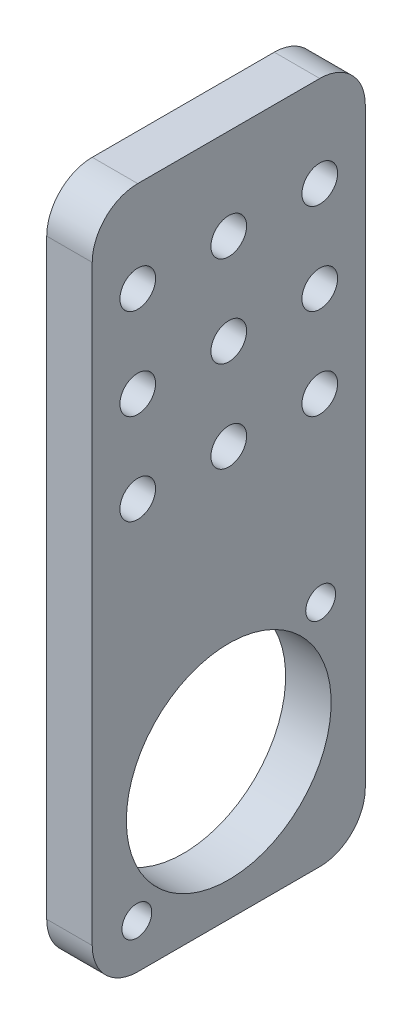
ISO-10303-21;
HEADER;
FILE_DESCRIPTION(('STEP AP214'),'2;1');
FILE_NAME('part.step','',(''),(''),'','','');
FILE_SCHEMA(('AUTOMOTIVE_DESIGN { 1 0 10303 214 1 1 1 1 }'));
ENDSEC;
DATA;
#1=APPLICATION_CONTEXT('core data for automotive mechanical design processes');
#2=APPLICATION_PROTOCOL_DEFINITION('international standard','automotive_design',2000,#1);
#3=PRODUCT_CONTEXT('',#1,'mechanical');
#4=PRODUCT('Part','Part','',(#3));
#5=PRODUCT_RELATED_PRODUCT_CATEGORY('part','',(#4));
#6=PRODUCT_DEFINITION_FORMATION('','',#4);
#7=PRODUCT_DEFINITION_CONTEXT('part definition',#1,'design');
#8=PRODUCT_DEFINITION('design','',#6,#7);
#9=PRODUCT_DEFINITION_SHAPE('','',#8);
#10=(LENGTH_UNIT() NAMED_UNIT(*) SI_UNIT(.MILLI.,.METRE.));
#11=(NAMED_UNIT(*) PLANE_ANGLE_UNIT() SI_UNIT($,.RADIAN.));
#12=(NAMED_UNIT(*) SI_UNIT($,.STERADIAN.) SOLID_ANGLE_UNIT());
#13=UNCERTAINTY_MEASURE_WITH_UNIT(LENGTH_MEASURE(1.E-05),#10,'distance_accuracy_value','');
#14=(GEOMETRIC_REPRESENTATION_CONTEXT(3) GLOBAL_UNCERTAINTY_ASSIGNED_CONTEXT((#13)) GLOBAL_UNIT_ASSIGNED_CONTEXT((#10,
#11,#12)) REPRESENTATION_CONTEXT('',''));
#15=CARTESIAN_POINT('',(0.,0.,0.));
#16=DIRECTION('',(0.,0.,1.));
#17=DIRECTION('',(1.,0.,0.));
#18=AXIS2_PLACEMENT_3D('',#15,#16,#17);
#19=CARTESIAN_POINT('',(88.9,-107.95,190.5));
#20=DIRECTION('',(1.,0.,0.));
#21=DIRECTION('',(0.,0.,-1.));
#22=AXIS2_PLACEMENT_3D('',#19,#20,#21);
#23=CYLINDRICAL_SURFACE('',#22,6.34999999999999);
#24=CARTESIAN_POINT('',(95.25,-107.95,190.5));
#25=DIRECTION('',(1.,0.,0.));
#26=DIRECTION('',(0.,0.,-1.));
#27=AXIS2_PLACEMENT_3D('',#24,#25,#26);
#28=CIRCLE('',#27,6.34999999999999);
#29=CARTESIAN_POINT('',(95.25,-114.3,190.5));
#30=VERTEX_POINT('',#29);
#31=CARTESIAN_POINT('',(95.25,-107.95,184.15));
#32=VERTEX_POINT('',#31);
#33=EDGE_CURVE('E146',#30,#32,#28,.T.);
#34=ORIENTED_EDGE('',*,*,#33,.F.);
#35=DIRECTION('',(1.,0.,0.));
#36=VECTOR('',#35,1.);
#37=CARTESIAN_POINT('',(88.9,-114.3,190.5));
#38=LINE('',#37,#36);
#39=CARTESIAN_POINT('',(88.9,-114.3,190.5));
#40=VERTEX_POINT('',#39);
#41=EDGE_CURVE('E11',#40,#30,#38,.T.);
#42=ORIENTED_EDGE('',*,*,#41,.F.);
#43=CARTESIAN_POINT('',(88.9,-107.95,190.5));
#44=DIRECTION('',(1.,0.,0.));
#45=DIRECTION('',(0.,0.,-1.));
#46=AXIS2_PLACEMENT_3D('',#43,#44,#45);
#47=CIRCLE('',#46,6.34999999999999);
#48=CARTESIAN_POINT('',(88.9,-107.95,184.15));
#49=VERTEX_POINT('',#48);
#50=EDGE_CURVE('E175',#40,#49,#47,.T.);
#51=ORIENTED_EDGE('',*,*,#50,.T.);
#52=DIRECTION('',(1.,0.,0.));
#53=VECTOR('',#52,1.);
#54=CARTESIAN_POINT('',(88.9,-107.95,184.15));
#55=LINE('',#54,#53);
#56=EDGE_CURVE('E46',#49,#32,#55,.T.);
#57=ORIENTED_EDGE('',*,*,#56,.T.);
#58=EDGE_LOOP('',(#34,#42,#51,#57));
#59=FACE_BOUND('',#58,.T.);
#60=ADVANCED_FACE('F43',(#59),#23,.T.);
#61=CARTESIAN_POINT('',(88.9,-114.3,215.9));
#62=DIRECTION('',(0.,-1.,0.));
#63=DIRECTION('',(0.,0.,-1.));
#64=AXIS2_PLACEMENT_3D('',#61,#62,#63);
#65=PLANE('',#64);
#66=DIRECTION('',(0.,0.,-1.));
#67=VECTOR('',#66,1.);
#68=CARTESIAN_POINT('',(95.25,-114.3,215.9));
#69=LINE('',#68,#67);
#70=CARTESIAN_POINT('',(95.25,-114.3,215.9));
#71=VERTEX_POINT('',#70);
#72=EDGE_CURVE('E172',#71,#30,#69,.T.);
#73=ORIENTED_EDGE('',*,*,#72,.F.);
#74=DIRECTION('',(1.,0.,0.));
#75=VECTOR('',#74,1.);
#76=CARTESIAN_POINT('',(88.9,-114.3,215.9));
#77=LINE('',#76,#75);
#78=CARTESIAN_POINT('',(88.9,-114.3,215.9));
#79=VERTEX_POINT('',#78);
#80=EDGE_CURVE('E53',#79,#71,#77,.T.);
#81=ORIENTED_EDGE('',*,*,#80,.F.);
#82=DIRECTION('',(0.,0.,-1.));
#83=VECTOR('',#82,1.);
#84=CARTESIAN_POINT('',(88.9,-114.3,215.9));
#85=LINE('',#84,#83);
#86=EDGE_CURVE('E132',#79,#40,#85,.T.);
#87=ORIENTED_EDGE('',*,*,#86,.T.);
#88=ORIENTED_EDGE('',*,*,#41,.T.);
#89=EDGE_LOOP('',(#73,#81,#87,#88));
#90=FACE_BOUND('',#89,.T.);
#91=ADVANCED_FACE('F193',(#90),#65,.T.);
#92=CARTESIAN_POINT('',(88.9,-107.95,215.9));
#93=DIRECTION('',(1.,0.,0.));
#94=DIRECTION('',(0.,0.,-1.));
#95=AXIS2_PLACEMENT_3D('',#92,#93,#94);
#96=CYLINDRICAL_SURFACE('',#95,6.34999999999999);
#97=CARTESIAN_POINT('',(95.25,-107.95,215.9));
#98=DIRECTION('',(1.,0.,0.));
#99=DIRECTION('',(0.,0.,-1.));
#100=AXIS2_PLACEMENT_3D('',#97,#98,#99);
#101=CIRCLE('',#100,6.34999999999999);
#102=CARTESIAN_POINT('',(95.25,-107.95,222.25));
#103=VERTEX_POINT('',#102);
#104=EDGE_CURVE('E118',#103,#71,#101,.T.);
#105=ORIENTED_EDGE('',*,*,#104,.F.);
#106=DIRECTION('',(1.,0.,0.));
#107=VECTOR('',#106,1.);
#108=CARTESIAN_POINT('',(88.9,-107.95,222.25));
#109=LINE('',#108,#107);
#110=CARTESIAN_POINT('',(88.9,-107.95,222.25));
#111=VERTEX_POINT('',#110);
#112=EDGE_CURVE('E113',#111,#103,#109,.T.);
#113=ORIENTED_EDGE('',*,*,#112,.F.);
#114=CARTESIAN_POINT('',(88.9,-107.95,215.9));
#115=DIRECTION('',(1.,0.,0.));
#116=DIRECTION('',(0.,0.,-1.));
#117=AXIS2_PLACEMENT_3D('',#114,#115,#116);
#118=CIRCLE('',#117,6.34999999999999);
#119=EDGE_CURVE('E116',#111,#79,#118,.T.);
#120=ORIENTED_EDGE('',*,*,#119,.T.);
#121=ORIENTED_EDGE('',*,*,#80,.T.);
#122=EDGE_LOOP('',(#105,#113,#120,#121));
#123=FACE_BOUND('',#122,.T.);
#124=ADVANCED_FACE('F115',(#123),#96,.T.);
#125=CARTESIAN_POINT('',(88.9,-25.3999999999998,222.25));
#126=DIRECTION('',(0.,0.,1.));
#127=DIRECTION('',(1.,0.,0.));
#128=AXIS2_PLACEMENT_3D('',#125,#126,#127);
#129=PLANE('',#128);
#130=DIRECTION('',(0.,-1.,0.));
#131=VECTOR('',#130,1.);
#132=CARTESIAN_POINT('',(95.25,-25.3999999999998,222.25));
#133=LINE('',#132,#131);
#134=CARTESIAN_POINT('',(95.25,-25.3999999999998,222.25));
#135=VERTEX_POINT('',#134);
#136=EDGE_CURVE('E167',#135,#103,#133,.T.);
#137=ORIENTED_EDGE('',*,*,#136,.F.);
#138=DIRECTION('',(1.,0.,0.));
#139=VECTOR('',#138,1.);
#140=CARTESIAN_POINT('',(88.9,-25.3999999999998,222.25));
#141=LINE('',#140,#139);
#142=CARTESIAN_POINT('',(88.9,-25.3999999999998,222.25));
#143=VERTEX_POINT('',#142);
#144=EDGE_CURVE('E124',#143,#135,#141,.T.);
#145=ORIENTED_EDGE('',*,*,#144,.F.);
#146=DIRECTION('',(0.,-1.,0.));
#147=VECTOR('',#146,1.);
#148=CARTESIAN_POINT('',(88.9,-25.3999999999998,222.25));
#149=LINE('',#148,#147);
#150=EDGE_CURVE('E130',#143,#111,#149,.T.);
#151=ORIENTED_EDGE('',*,*,#150,.T.);
#152=ORIENTED_EDGE('',*,*,#112,.T.);
#153=EDGE_LOOP('',(#137,#145,#151,#152));
#154=FACE_BOUND('',#153,.T.);
#155=ADVANCED_FACE('F135',(#154),#129,.T.);
#156=CARTESIAN_POINT('',(88.9,-25.3999999999999,215.9));
#157=DIRECTION('',(1.,0.,0.));
#158=DIRECTION('',(0.,0.,-1.));
#159=AXIS2_PLACEMENT_3D('',#156,#157,#158);
#160=CYLINDRICAL_SURFACE('',#159,6.34999999999993);
#161=CARTESIAN_POINT('',(95.25,-25.3999999999999,215.9));
#162=DIRECTION('',(1.,0.,0.));
#163=DIRECTION('',(0.,0.,-1.));
#164=AXIS2_PLACEMENT_3D('',#161,#162,#163);
#165=CIRCLE('',#164,6.34999999999993);
#166=CARTESIAN_POINT('',(95.25,-19.05,215.9));
#167=VERTEX_POINT('',#166);
#168=EDGE_CURVE('E163',#167,#135,#165,.T.);
#169=ORIENTED_EDGE('',*,*,#168,.F.);
#170=DIRECTION('',(1.,0.,0.));
#171=VECTOR('',#170,1.);
#172=CARTESIAN_POINT('',(88.9,-19.05,215.9));
#173=LINE('',#172,#171);
#174=CARTESIAN_POINT('',(88.9,-19.05,215.9));
#175=VERTEX_POINT('',#174);
#176=EDGE_CURVE('E181',#175,#167,#173,.T.);
#177=ORIENTED_EDGE('',*,*,#176,.F.);
#178=CARTESIAN_POINT('',(88.9,-25.3999999999999,215.9));
#179=DIRECTION('',(1.,0.,0.));
#180=DIRECTION('',(0.,0.,-1.));
#181=AXIS2_PLACEMENT_3D('',#178,#179,#180);
#182=CIRCLE('',#181,6.34999999999993);
#183=EDGE_CURVE('E137',#175,#143,#182,.T.);
#184=ORIENTED_EDGE('',*,*,#183,.T.);
#185=ORIENTED_EDGE('',*,*,#144,.T.);
#186=EDGE_LOOP('',(#169,#177,#184,#185));
#187=FACE_BOUND('',#186,.T.);
#188=ADVANCED_FACE('F206',(#187),#160,.T.);
#189=CARTESIAN_POINT('',(88.9,-19.05,190.5));
#190=DIRECTION('',(0.,1.,0.));
#191=DIRECTION('',(0.,0.,1.));
#192=AXIS2_PLACEMENT_3D('',#189,#190,#191);
#193=PLANE('',#192);
#194=DIRECTION('',(0.,0.,1.));
#195=VECTOR('',#194,1.);
#196=CARTESIAN_POINT('',(95.25,-19.05,190.5));
#197=LINE('',#196,#195);
#198=CARTESIAN_POINT('',(95.25,-19.0499999999999,190.5));
#199=VERTEX_POINT('',#198);
#200=EDGE_CURVE('E159',#199,#167,#197,.T.);
#201=ORIENTED_EDGE('',*,*,#200,.F.);
#202=DIRECTION('',(1.,0.,0.));
#203=VECTOR('',#202,1.);
#204=CARTESIAN_POINT('',(88.9,-19.0499999999999,190.5));
#205=LINE('',#204,#203);
#206=CARTESIAN_POINT('',(88.9,-19.0499999999999,190.5));
#207=VERTEX_POINT('',#206);
#208=EDGE_CURVE('E184',#207,#199,#205,.T.);
#209=ORIENTED_EDGE('',*,*,#208,.F.);
#210=DIRECTION('',(0.,0.,1.));
#211=VECTOR('',#210,1.);
#212=CARTESIAN_POINT('',(88.9,-19.05,190.5));
#213=LINE('',#212,#211);
#214=EDGE_CURVE('E140',#207,#175,#213,.T.);
#215=ORIENTED_EDGE('',*,*,#214,.T.);
#216=ORIENTED_EDGE('',*,*,#176,.T.);
#217=EDGE_LOOP('',(#201,#209,#215,#216));
#218=FACE_BOUND('',#217,.T.);
#219=ADVANCED_FACE('F209',(#218),#193,.T.);
#220=CARTESIAN_POINT('',(88.9,-25.3999999999998,190.5));
#221=DIRECTION('',(1.,0.,0.));
#222=DIRECTION('',(0.,0.,-1.));
#223=AXIS2_PLACEMENT_3D('',#220,#221,#222);
#224=CYLINDRICAL_SURFACE('',#223,6.34999999999989);
#225=CARTESIAN_POINT('',(95.25,-25.3999999999998,190.5));
#226=DIRECTION('',(1.,0.,0.));
#227=DIRECTION('',(0.,0.,-1.));
#228=AXIS2_PLACEMENT_3D('',#225,#226,#227);
#229=CIRCLE('',#228,6.34999999999989);
#230=CARTESIAN_POINT('',(95.25,-25.3999999999998,184.15));
#231=VERTEX_POINT('',#230);
#232=EDGE_CURVE('E155',#231,#199,#229,.T.);
#233=ORIENTED_EDGE('',*,*,#232,.F.);
#234=DIRECTION('',(1.,0.,0.));
#235=VECTOR('',#234,1.);
#236=CARTESIAN_POINT('',(88.9,-25.3999999999998,184.15));
#237=LINE('',#236,#235);
#238=CARTESIAN_POINT('',(88.9,-25.3999999999998,184.15));
#239=VERTEX_POINT('',#238);
#240=EDGE_CURVE('E186',#239,#231,#237,.T.);
#241=ORIENTED_EDGE('',*,*,#240,.F.);
#242=CARTESIAN_POINT('',(88.9,-25.3999999999998,190.5));
#243=DIRECTION('',(1.,0.,0.));
#244=DIRECTION('',(0.,0.,-1.));
#245=AXIS2_PLACEMENT_3D('',#242,#243,#244);
#246=CIRCLE('',#245,6.34999999999989);
#247=EDGE_CURVE('E381',#239,#207,#246,.T.);
#248=ORIENTED_EDGE('',*,*,#247,.T.);
#249=ORIENTED_EDGE('',*,*,#208,.T.);
#250=EDGE_LOOP('',(#233,#241,#248,#249));
#251=FACE_BOUND('',#250,.T.);
#252=ADVANCED_FACE('F213',(#251),#224,.T.);
#253=CARTESIAN_POINT('',(88.9,-107.95,184.15));
#254=DIRECTION('',(0.,0.,-1.));
#255=DIRECTION('',(-1.,0.,0.));
#256=AXIS2_PLACEMENT_3D('',#253,#254,#255);
#257=PLANE('',#256);
#258=DIRECTION('',(0.,1.,0.));
#259=VECTOR('',#258,1.);
#260=CARTESIAN_POINT('',(95.25,-107.95,184.15));
#261=LINE('',#260,#259);
#262=EDGE_CURVE('E150',#32,#231,#261,.T.);
#263=ORIENTED_EDGE('',*,*,#262,.F.);
#264=ORIENTED_EDGE('',*,*,#56,.F.);
#265=DIRECTION('',(0.,1.,0.));
#266=VECTOR('',#265,1.);
#267=CARTESIAN_POINT('',(88.9,-107.95,184.15));
#268=LINE('',#267,#266);
#269=EDGE_CURVE('E378',#49,#239,#268,.T.);
#270=ORIENTED_EDGE('',*,*,#269,.T.);
#271=ORIENTED_EDGE('',*,*,#240,.T.);
#272=EDGE_LOOP('',(#263,#264,#270,#271));
#273=FACE_BOUND('',#272,.T.);
#274=ADVANCED_FACE('F190',(#273),#257,.T.);
#275=CARTESIAN_POINT('',(88.9,-107.95,190.5));
#276=DIRECTION('',(1.,0.,0.));
#277=DIRECTION('',(0.,0.,-1.));
#278=AXIS2_PLACEMENT_3D('',#275,#276,#277);
#279=PLANE('',#278);
#280=CARTESIAN_POINT('',(88.9,-44.45,190.5));
#281=DIRECTION('',(1.,0.,0.));
#282=DIRECTION('',(0.,0.,1.));
#283=AXIS2_PLACEMENT_3D('',#280,#281,#282);
#284=CIRCLE('',#283,2.4892);
#285=CARTESIAN_POINT('',(88.9,-44.45,192.9892));
#286=VERTEX_POINT('',#285);
#287=EDGE_CURVE('E280',#286,#286,#284,.T.);
#288=ORIENTED_EDGE('',*,*,#287,.T.);
#289=EDGE_LOOP('',(#288));
#290=FACE_BOUND('',#289,.T.);
#291=CARTESIAN_POINT('',(88.9,-44.45,203.2));
#292=DIRECTION('',(1.,0.,0.));
#293=DIRECTION('',(0.,0.,1.));
#294=AXIS2_PLACEMENT_3D('',#291,#292,#293);
#295=CIRCLE('',#294,2.4892);
#296=CARTESIAN_POINT('',(88.9,-44.45,205.6892));
#297=VERTEX_POINT('',#296);
#298=EDGE_CURVE('E290',#297,#297,#295,.T.);
#299=ORIENTED_EDGE('',*,*,#298,.T.);
#300=EDGE_LOOP('',(#299));
#301=FACE_BOUND('',#300,.T.);
#302=CARTESIAN_POINT('',(88.9,-44.45,215.9));
#303=DIRECTION('',(1.,0.,0.));
#304=DIRECTION('',(0.,0.,1.));
#305=AXIS2_PLACEMENT_3D('',#302,#303,#304);
#306=CIRCLE('',#305,2.4892);
#307=CARTESIAN_POINT('',(88.9,-44.45,218.3892));
#308=VERTEX_POINT('',#307);
#309=EDGE_CURVE('E298',#308,#308,#306,.T.);
#310=ORIENTED_EDGE('',*,*,#309,.T.);
#311=EDGE_LOOP('',(#310));
#312=FACE_BOUND('',#311,.T.);
#313=CARTESIAN_POINT('',(88.9,-57.15,190.5));
#314=DIRECTION('',(1.,0.,0.));
#315=DIRECTION('',(0.,0.,1.));
#316=AXIS2_PLACEMENT_3D('',#313,#314,#315);
#317=CIRCLE('',#316,2.4892);
#318=CARTESIAN_POINT('',(88.9,-57.15,192.9892));
#319=VERTEX_POINT('',#318);
#320=EDGE_CURVE('E306',#319,#319,#317,.T.);
#321=ORIENTED_EDGE('',*,*,#320,.T.);
#322=EDGE_LOOP('',(#321));
#323=FACE_BOUND('',#322,.T.);
#324=CARTESIAN_POINT('',(88.9,-57.15,203.2));
#325=DIRECTION('',(1.,0.,0.));
#326=DIRECTION('',(0.,0.,1.));
#327=AXIS2_PLACEMENT_3D('',#324,#325,#326);
#328=CIRCLE('',#327,2.4892);
#329=CARTESIAN_POINT('',(88.9,-57.15,205.6892));
#330=VERTEX_POINT('',#329);
#331=EDGE_CURVE('E314',#330,#330,#328,.T.);
#332=ORIENTED_EDGE('',*,*,#331,.T.);
#333=EDGE_LOOP('',(#332));
#334=FACE_BOUND('',#333,.T.);
#335=CARTESIAN_POINT('',(88.9,-57.15,215.9));
#336=DIRECTION('',(1.,0.,0.));
#337=DIRECTION('',(0.,0.,1.));
#338=AXIS2_PLACEMENT_3D('',#335,#336,#337);
#339=CIRCLE('',#338,2.4892);
#340=CARTESIAN_POINT('',(88.9,-57.15,218.3892));
#341=VERTEX_POINT('',#340);
#342=EDGE_CURVE('E322',#341,#341,#339,.T.);
#343=ORIENTED_EDGE('',*,*,#342,.T.);
#344=EDGE_LOOP('',(#343));
#345=FACE_BOUND('',#344,.T.);
#346=CARTESIAN_POINT('',(88.9,-31.75,190.5));
#347=DIRECTION('',(1.,0.,0.));
#348=DIRECTION('',(0.,0.,1.));
#349=AXIS2_PLACEMENT_3D('',#346,#347,#348);
#350=CIRCLE('',#349,2.4892);
#351=CARTESIAN_POINT('',(88.9,-31.75,192.9892));
#352=VERTEX_POINT('',#351);
#353=EDGE_CURVE('E330',#352,#352,#350,.T.);
#354=ORIENTED_EDGE('',*,*,#353,.T.);
#355=EDGE_LOOP('',(#354));
#356=FACE_BOUND('',#355,.T.);
#357=CARTESIAN_POINT('',(88.9,-31.75,203.2));
#358=DIRECTION('',(1.,0.,0.));
#359=DIRECTION('',(0.,0.,1.));
#360=AXIS2_PLACEMENT_3D('',#357,#358,#359);
#361=CIRCLE('',#360,2.4892);
#362=CARTESIAN_POINT('',(88.9,-31.75,205.6892));
#363=VERTEX_POINT('',#362);
#364=EDGE_CURVE('E338',#363,#363,#361,.T.);
#365=ORIENTED_EDGE('',*,*,#364,.T.);
#366=EDGE_LOOP('',(#365));
#367=FACE_BOUND('',#366,.T.);
#368=CARTESIAN_POINT('',(88.9,-31.75,215.9));
#369=DIRECTION('',(1.,0.,0.));
#370=DIRECTION('',(0.,0.,1.));
#371=AXIS2_PLACEMENT_3D('',#368,#369,#370);
#372=CIRCLE('',#371,2.4892);
#373=CARTESIAN_POINT('',(88.9,-31.75,218.3892));
#374=VERTEX_POINT('',#373);
#375=EDGE_CURVE('E346',#374,#374,#372,.T.);
#376=ORIENTED_EDGE('',*,*,#375,.T.);
#377=EDGE_LOOP('',(#376));
#378=FACE_BOUND('',#377,.T.);
#379=CARTESIAN_POINT('',(88.9,-95.25,203.2));
#380=DIRECTION('',(1.,0.,0.));
#381=DIRECTION('',(0.,0.,1.));
#382=AXIS2_PLACEMENT_3D('',#379,#380,#381);
#383=CIRCLE('',#382,14.2875);
#384=CARTESIAN_POINT('',(88.9,-95.25,217.4875));
#385=VERTEX_POINT('',#384);
#386=EDGE_CURVE('E354',#385,#385,#383,.T.);
#387=ORIENTED_EDGE('',*,*,#386,.T.);
#388=EDGE_LOOP('',(#387));
#389=FACE_BOUND('',#388,.T.);
#390=CARTESIAN_POINT('',(88.9,-108.073805740887,216.023805740887));
#391=DIRECTION('',(1.,0.,0.));
#392=DIRECTION('',(0.,0.,1.));
#393=AXIS2_PLACEMENT_3D('',#390,#391,#392);
#394=CIRCLE('',#393,2.0828);
#395=CARTESIAN_POINT('',(88.9,-108.073805740887,218.106605740886));
#396=VERTEX_POINT('',#395);
#397=EDGE_CURVE('E362',#396,#396,#394,.T.);
#398=ORIENTED_EDGE('',*,*,#397,.T.);
#399=EDGE_LOOP('',(#398));
#400=FACE_BOUND('',#399,.T.);
#401=CARTESIAN_POINT('',(88.9,-82.4261942591132,190.376194259113));
#402=DIRECTION('',(1.,0.,0.));
#403=DIRECTION('',(0.,0.,1.));
#404=AXIS2_PLACEMENT_3D('',#401,#402,#403);
#405=CIRCLE('',#404,2.0828);
#406=CARTESIAN_POINT('',(88.9,-82.4261942591132,192.458994259113));
#407=VERTEX_POINT('',#406);
#408=EDGE_CURVE('E151',#407,#407,#405,.T.);
#409=ORIENTED_EDGE('',*,*,#408,.T.);
#410=EDGE_LOOP('',(#409));
#411=FACE_BOUND('',#410,.T.);
#412=ORIENTED_EDGE('',*,*,#50,.F.);
#413=ORIENTED_EDGE('',*,*,#86,.F.);
#414=ORIENTED_EDGE('',*,*,#119,.F.);
#415=ORIENTED_EDGE('',*,*,#150,.F.);
#416=ORIENTED_EDGE('',*,*,#183,.F.);
#417=ORIENTED_EDGE('',*,*,#214,.F.);
#418=ORIENTED_EDGE('',*,*,#247,.F.);
#419=ORIENTED_EDGE('',*,*,#269,.F.);
#420=EDGE_LOOP('',(#412,#413,#414,#415,#416,#417,#418,#419));
#421=FACE_BOUND('',#420,.T.);
#422=ADVANCED_FACE('F128',(#290,#301,#312,#323,#334,#345,#356,#367,#378,#389,#400,#411,#421),
#279,.F.);
#423=CARTESIAN_POINT('',(95.25,-107.95,190.5));
#424=DIRECTION('',(1.,0.,0.));
#425=DIRECTION('',(0.,0.,-1.));
#426=AXIS2_PLACEMENT_3D('',#423,#424,#425);
#427=PLANE('',#426);
#428=CARTESIAN_POINT('',(95.25,-44.45,190.5));
#429=DIRECTION('',(1.,0.,0.));
#430=DIRECTION('',(0.,0.,1.));
#431=AXIS2_PLACEMENT_3D('',#428,#429,#430);
#432=CIRCLE('',#431,2.4892);
#433=CARTESIAN_POINT('',(95.25,-44.45,192.9892));
#434=VERTEX_POINT('',#433);
#435=EDGE_CURVE('E283',#434,#434,#432,.T.);
#436=ORIENTED_EDGE('',*,*,#435,.F.);
#437=EDGE_LOOP('',(#436));
#438=FACE_BOUND('',#437,.T.);
#439=CARTESIAN_POINT('',(95.25,-44.45,203.2));
#440=DIRECTION('',(1.,0.,0.));
#441=DIRECTION('',(0.,0.,1.));
#442=AXIS2_PLACEMENT_3D('',#439,#440,#441);
#443=CIRCLE('',#442,2.4892);
#444=CARTESIAN_POINT('',(95.25,-44.45,205.6892));
#445=VERTEX_POINT('',#444);
#446=EDGE_CURVE('E287',#445,#445,#443,.T.);
#447=ORIENTED_EDGE('',*,*,#446,.F.);
#448=EDGE_LOOP('',(#447));
#449=FACE_BOUND('',#448,.T.);
#450=CARTESIAN_POINT('',(95.25,-44.45,215.9));
#451=DIRECTION('',(1.,0.,0.));
#452=DIRECTION('',(0.,0.,1.));
#453=AXIS2_PLACEMENT_3D('',#450,#451,#452);
#454=CIRCLE('',#453,2.4892);
#455=CARTESIAN_POINT('',(95.25,-44.45,218.3892));
#456=VERTEX_POINT('',#455);
#457=EDGE_CURVE('E294',#456,#456,#454,.T.);
#458=ORIENTED_EDGE('',*,*,#457,.F.);
#459=EDGE_LOOP('',(#458));
#460=FACE_BOUND('',#459,.T.);
#461=CARTESIAN_POINT('',(95.25,-57.15,190.5));
#462=DIRECTION('',(1.,0.,0.));
#463=DIRECTION('',(0.,0.,1.));
#464=AXIS2_PLACEMENT_3D('',#461,#462,#463);
#465=CIRCLE('',#464,2.4892);
#466=CARTESIAN_POINT('',(95.25,-57.15,192.9892));
#467=VERTEX_POINT('',#466);
#468=EDGE_CURVE('E302',#467,#467,#465,.T.);
#469=ORIENTED_EDGE('',*,*,#468,.F.);
#470=EDGE_LOOP('',(#469));
#471=FACE_BOUND('',#470,.T.);
#472=CARTESIAN_POINT('',(95.25,-57.15,203.2));
#473=DIRECTION('',(1.,0.,0.));
#474=DIRECTION('',(0.,0.,1.));
#475=AXIS2_PLACEMENT_3D('',#472,#473,#474);
#476=CIRCLE('',#475,2.4892);
#477=CARTESIAN_POINT('',(95.25,-57.15,205.6892));
#478=VERTEX_POINT('',#477);
#479=EDGE_CURVE('E310',#478,#478,#476,.T.);
#480=ORIENTED_EDGE('',*,*,#479,.F.);
#481=EDGE_LOOP('',(#480));
#482=FACE_BOUND('',#481,.T.);
#483=CARTESIAN_POINT('',(95.25,-57.15,215.9));
#484=DIRECTION('',(1.,0.,0.));
#485=DIRECTION('',(0.,0.,1.));
#486=AXIS2_PLACEMENT_3D('',#483,#484,#485);
#487=CIRCLE('',#486,2.4892);
#488=CARTESIAN_POINT('',(95.25,-57.15,218.3892));
#489=VERTEX_POINT('',#488);
#490=EDGE_CURVE('E318',#489,#489,#487,.T.);
#491=ORIENTED_EDGE('',*,*,#490,.F.);
#492=EDGE_LOOP('',(#491));
#493=FACE_BOUND('',#492,.T.);
#494=CARTESIAN_POINT('',(95.25,-31.75,190.5));
#495=DIRECTION('',(1.,0.,0.));
#496=DIRECTION('',(0.,0.,1.));
#497=AXIS2_PLACEMENT_3D('',#494,#495,#496);
#498=CIRCLE('',#497,2.4892);
#499=CARTESIAN_POINT('',(95.25,-31.75,192.9892));
#500=VERTEX_POINT('',#499);
#501=EDGE_CURVE('E326',#500,#500,#498,.T.);
#502=ORIENTED_EDGE('',*,*,#501,.F.);
#503=EDGE_LOOP('',(#502));
#504=FACE_BOUND('',#503,.T.);
#505=CARTESIAN_POINT('',(95.25,-31.75,203.2));
#506=DIRECTION('',(1.,0.,0.));
#507=DIRECTION('',(0.,0.,1.));
#508=AXIS2_PLACEMENT_3D('',#505,#506,#507);
#509=CIRCLE('',#508,2.4892);
#510=CARTESIAN_POINT('',(95.25,-31.75,205.6892));
#511=VERTEX_POINT('',#510);
#512=EDGE_CURVE('E334',#511,#511,#509,.T.);
#513=ORIENTED_EDGE('',*,*,#512,.F.);
#514=EDGE_LOOP('',(#513));
#515=FACE_BOUND('',#514,.T.);
#516=CARTESIAN_POINT('',(95.25,-31.75,215.9));
#517=DIRECTION('',(1.,0.,0.));
#518=DIRECTION('',(0.,0.,1.));
#519=AXIS2_PLACEMENT_3D('',#516,#517,#518);
#520=CIRCLE('',#519,2.4892);
#521=CARTESIAN_POINT('',(95.25,-31.75,218.3892));
#522=VERTEX_POINT('',#521);
#523=EDGE_CURVE('E342',#522,#522,#520,.T.);
#524=ORIENTED_EDGE('',*,*,#523,.F.);
#525=EDGE_LOOP('',(#524));
#526=FACE_BOUND('',#525,.T.);
#527=CARTESIAN_POINT('',(95.25,-95.25,203.2));
#528=DIRECTION('',(1.,0.,0.));
#529=DIRECTION('',(0.,0.,1.));
#530=AXIS2_PLACEMENT_3D('',#527,#528,#529);
#531=CIRCLE('',#530,14.2875);
#532=CARTESIAN_POINT('',(95.25,-95.25,217.4875));
#533=VERTEX_POINT('',#532);
#534=EDGE_CURVE('E350',#533,#533,#531,.T.);
#535=ORIENTED_EDGE('',*,*,#534,.F.);
#536=EDGE_LOOP('',(#535));
#537=FACE_BOUND('',#536,.T.);
#538=CARTESIAN_POINT('',(95.25,-108.073805740887,216.023805740887));
#539=DIRECTION('',(1.,0.,0.));
#540=DIRECTION('',(0.,0.,1.));
#541=AXIS2_PLACEMENT_3D('',#538,#539,#540);
#542=CIRCLE('',#541,2.0828);
#543=CARTESIAN_POINT('',(95.25,-108.073805740887,218.106605740886));
#544=VERTEX_POINT('',#543);
#545=EDGE_CURVE('E358',#544,#544,#542,.T.);
#546=ORIENTED_EDGE('',*,*,#545,.F.);
#547=EDGE_LOOP('',(#546));
#548=FACE_BOUND('',#547,.T.);
#549=CARTESIAN_POINT('',(95.25,-82.4261942591132,190.376194259113));
#550=DIRECTION('',(1.,0.,0.));
#551=DIRECTION('',(0.,0.,1.));
#552=AXIS2_PLACEMENT_3D('',#549,#550,#551);
#553=CIRCLE('',#552,2.0828);
#554=CARTESIAN_POINT('',(95.25,-82.4261942591132,192.458994259113));
#555=VERTEX_POINT('',#554);
#556=EDGE_CURVE('E366',#555,#555,#553,.T.);
#557=ORIENTED_EDGE('',*,*,#556,.F.);
#558=EDGE_LOOP('',(#557));
#559=FACE_BOUND('',#558,.T.);
#560=ORIENTED_EDGE('',*,*,#33,.T.);
#561=ORIENTED_EDGE('',*,*,#262,.T.);
#562=ORIENTED_EDGE('',*,*,#232,.T.);
#563=ORIENTED_EDGE('',*,*,#200,.T.);
#564=ORIENTED_EDGE('',*,*,#168,.T.);
#565=ORIENTED_EDGE('',*,*,#136,.T.);
#566=ORIENTED_EDGE('',*,*,#104,.T.);
#567=ORIENTED_EDGE('',*,*,#72,.T.);
#568=EDGE_LOOP('',(#560,#561,#562,#563,#564,#565,#566,#567));
#569=FACE_BOUND('',#568,.T.);
#570=ADVANCED_FACE('F192',(#438,#449,#460,#471,#482,#493,#504,#515,#526,#537,#548,#559,#569),
#427,.T.);
#571=CARTESIAN_POINT('',(88.9,-82.4261942591132,190.376194259113));
#572=DIRECTION('',(1.,0.,0.));
#573=DIRECTION('',(0.,0.,-1.));
#574=AXIS2_PLACEMENT_3D('',#571,#572,#573);
#575=CYLINDRICAL_SURFACE('',#574,2.0828);
#576=ORIENTED_EDGE('',*,*,#408,.F.);
#577=EDGE_LOOP('',(#576));
#578=FACE_BOUND('',#577,.T.);
#579=ORIENTED_EDGE('',*,*,#556,.T.);
#580=EDGE_LOOP('',(#579));
#581=FACE_BOUND('',#580,.T.);
#582=ADVANCED_FACE('F225',(#578,#581),#575,.F.);
#583=CARTESIAN_POINT('',(88.9,-108.073805740887,216.023805740887));
#584=DIRECTION('',(1.,0.,0.));
#585=DIRECTION('',(0.,0.,-1.));
#586=AXIS2_PLACEMENT_3D('',#583,#584,#585);
#587=CYLINDRICAL_SURFACE('',#586,2.0828);
#588=ORIENTED_EDGE('',*,*,#397,.F.);
#589=EDGE_LOOP('',(#588));
#590=FACE_BOUND('',#589,.T.);
#591=ORIENTED_EDGE('',*,*,#545,.T.);
#592=EDGE_LOOP('',(#591));
#593=FACE_BOUND('',#592,.T.);
#594=ADVANCED_FACE('F232',(#590,#593),#587,.F.);
#595=CARTESIAN_POINT('',(88.9,-95.25,203.2));
#596=DIRECTION('',(1.,0.,0.));
#597=DIRECTION('',(0.,0.,-1.));
#598=AXIS2_PLACEMENT_3D('',#595,#596,#597);
#599=CYLINDRICAL_SURFACE('',#598,14.2875);
#600=ORIENTED_EDGE('',*,*,#386,.F.);
#601=EDGE_LOOP('',(#600));
#602=FACE_BOUND('',#601,.T.);
#603=ORIENTED_EDGE('',*,*,#534,.T.);
#604=EDGE_LOOP('',(#603));
#605=FACE_BOUND('',#604,.T.);
#606=ADVANCED_FACE('F236',(#602,#605),#599,.F.);
#607=CARTESIAN_POINT('',(88.9,-31.75,215.9));
#608=DIRECTION('',(1.,0.,0.));
#609=DIRECTION('',(0.,0.,-1.));
#610=AXIS2_PLACEMENT_3D('',#607,#608,#609);
#611=CYLINDRICAL_SURFACE('',#610,2.4892);
#612=ORIENTED_EDGE('',*,*,#375,.F.);
#613=EDGE_LOOP('',(#612));
#614=FACE_BOUND('',#613,.T.);
#615=ORIENTED_EDGE('',*,*,#523,.T.);
#616=EDGE_LOOP('',(#615));
#617=FACE_BOUND('',#616,.T.);
#618=ADVANCED_FACE('F240',(#614,#617),#611,.F.);
#619=CARTESIAN_POINT('',(88.9,-31.75,203.2));
#620=DIRECTION('',(1.,0.,0.));
#621=DIRECTION('',(0.,0.,-1.));
#622=AXIS2_PLACEMENT_3D('',#619,#620,#621);
#623=CYLINDRICAL_SURFACE('',#622,2.4892);
#624=ORIENTED_EDGE('',*,*,#364,.F.);
#625=EDGE_LOOP('',(#624));
#626=FACE_BOUND('',#625,.T.);
#627=ORIENTED_EDGE('',*,*,#512,.T.);
#628=EDGE_LOOP('',(#627));
#629=FACE_BOUND('',#628,.T.);
#630=ADVANCED_FACE('F244',(#626,#629),#623,.F.);
#631=CARTESIAN_POINT('',(88.9,-31.75,190.5));
#632=DIRECTION('',(1.,0.,0.));
#633=DIRECTION('',(0.,0.,-1.));
#634=AXIS2_PLACEMENT_3D('',#631,#632,#633);
#635=CYLINDRICAL_SURFACE('',#634,2.4892);
#636=ORIENTED_EDGE('',*,*,#353,.F.);
#637=EDGE_LOOP('',(#636));
#638=FACE_BOUND('',#637,.T.);
#639=ORIENTED_EDGE('',*,*,#501,.T.);
#640=EDGE_LOOP('',(#639));
#641=FACE_BOUND('',#640,.T.);
#642=ADVANCED_FACE('F248',(#638,#641),#635,.F.);
#643=CARTESIAN_POINT('',(88.9,-57.15,215.9));
#644=DIRECTION('',(1.,0.,0.));
#645=DIRECTION('',(0.,0.,-1.));
#646=AXIS2_PLACEMENT_3D('',#643,#644,#645);
#647=CYLINDRICAL_SURFACE('',#646,2.4892);
#648=ORIENTED_EDGE('',*,*,#342,.F.);
#649=EDGE_LOOP('',(#648));
#650=FACE_BOUND('',#649,.T.);
#651=ORIENTED_EDGE('',*,*,#490,.T.);
#652=EDGE_LOOP('',(#651));
#653=FACE_BOUND('',#652,.T.);
#654=ADVANCED_FACE('F252',(#650,#653),#647,.F.);
#655=CARTESIAN_POINT('',(88.9,-57.15,203.2));
#656=DIRECTION('',(1.,0.,0.));
#657=DIRECTION('',(0.,0.,-1.));
#658=AXIS2_PLACEMENT_3D('',#655,#656,#657);
#659=CYLINDRICAL_SURFACE('',#658,2.4892);
#660=ORIENTED_EDGE('',*,*,#331,.F.);
#661=EDGE_LOOP('',(#660));
#662=FACE_BOUND('',#661,.T.);
#663=ORIENTED_EDGE('',*,*,#479,.T.);
#664=EDGE_LOOP('',(#663));
#665=FACE_BOUND('',#664,.T.);
#666=ADVANCED_FACE('F256',(#662,#665),#659,.F.);
#667=CARTESIAN_POINT('',(88.9,-57.15,190.5));
#668=DIRECTION('',(1.,0.,0.));
#669=DIRECTION('',(0.,0.,-1.));
#670=AXIS2_PLACEMENT_3D('',#667,#668,#669);
#671=CYLINDRICAL_SURFACE('',#670,2.4892);
#672=ORIENTED_EDGE('',*,*,#320,.F.);
#673=EDGE_LOOP('',(#672));
#674=FACE_BOUND('',#673,.T.);
#675=ORIENTED_EDGE('',*,*,#468,.T.);
#676=EDGE_LOOP('',(#675));
#677=FACE_BOUND('',#676,.T.);
#678=ADVANCED_FACE('F260',(#674,#677),#671,.F.);
#679=CARTESIAN_POINT('',(88.9,-44.45,215.9));
#680=DIRECTION('',(1.,0.,0.));
#681=DIRECTION('',(0.,0.,-1.));
#682=AXIS2_PLACEMENT_3D('',#679,#680,#681);
#683=CYLINDRICAL_SURFACE('',#682,2.4892);
#684=ORIENTED_EDGE('',*,*,#309,.F.);
#685=EDGE_LOOP('',(#684));
#686=FACE_BOUND('',#685,.T.);
#687=ORIENTED_EDGE('',*,*,#457,.T.);
#688=EDGE_LOOP('',(#687));
#689=FACE_BOUND('',#688,.T.);
#690=ADVANCED_FACE('F264',(#686,#689),#683,.F.);
#691=CARTESIAN_POINT('',(88.9,-44.45,203.2));
#692=DIRECTION('',(1.,0.,0.));
#693=DIRECTION('',(0.,0.,-1.));
#694=AXIS2_PLACEMENT_3D('',#691,#692,#693);
#695=CYLINDRICAL_SURFACE('',#694,2.4892);
#696=ORIENTED_EDGE('',*,*,#298,.F.);
#697=EDGE_LOOP('',(#696));
#698=FACE_BOUND('',#697,.T.);
#699=ORIENTED_EDGE('',*,*,#446,.T.);
#700=EDGE_LOOP('',(#699));
#701=FACE_BOUND('',#700,.T.);
#702=ADVANCED_FACE('F268',(#698,#701),#695,.F.);
#703=CARTESIAN_POINT('',(88.9,-44.45,190.5));
#704=DIRECTION('',(1.,0.,0.));
#705=DIRECTION('',(0.,0.,-1.));
#706=AXIS2_PLACEMENT_3D('',#703,#704,#705);
#707=CYLINDRICAL_SURFACE('',#706,2.4892);
#708=ORIENTED_EDGE('',*,*,#287,.F.);
#709=EDGE_LOOP('',(#708));
#710=FACE_BOUND('',#709,.T.);
#711=ORIENTED_EDGE('',*,*,#435,.T.);
#712=EDGE_LOOP('',(#711));
#713=FACE_BOUND('',#712,.T.);
#714=ADVANCED_FACE('F272',(#710,#713),#707,.F.);
#715=CLOSED_SHELL('',(#60,#91,#124,#155,#188,#219,#252,#274,#422,#570,#582,#594,#606,#618,#630,
#642,#654,#666,#678,#690,#702,#714));
#716=MANIFOLD_SOLID_BREP('B2',#715);
#717=ADVANCED_BREP_SHAPE_REPRESENTATION('',(#18,#716),#14);
#718=SHAPE_DEFINITION_REPRESENTATION(#9,#717);
ENDSEC;
END-ISO-10303-21;
